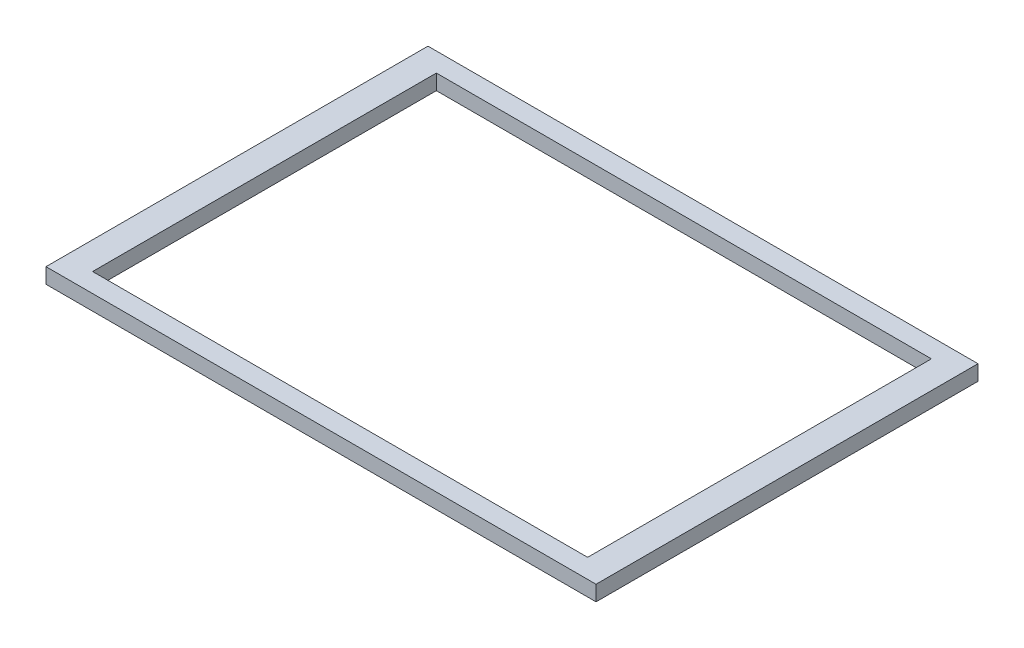
ISO-10303-21;
HEADER;
FILE_DESCRIPTION(('STEP AP214'),'2;1');
FILE_NAME('part.step','',(''),(''),'','','');
FILE_SCHEMA(('AUTOMOTIVE_DESIGN { 1 0 10303 214 1 1 1 1 }'));
ENDSEC;
DATA;
#1=APPLICATION_CONTEXT('core data for automotive mechanical design processes');
#2=APPLICATION_PROTOCOL_DEFINITION('international standard','automotive_design',2000,#1);
#3=PRODUCT_CONTEXT('',#1,'mechanical');
#4=PRODUCT('Part','Part','',(#3));
#5=PRODUCT_RELATED_PRODUCT_CATEGORY('part','',(#4));
#6=PRODUCT_DEFINITION_FORMATION('','',#4);
#7=PRODUCT_DEFINITION_CONTEXT('part definition',#1,'design');
#8=PRODUCT_DEFINITION('design','',#6,#7);
#9=PRODUCT_DEFINITION_SHAPE('','',#8);
#10=(LENGTH_UNIT() NAMED_UNIT(*) SI_UNIT(.MILLI.,.METRE.));
#11=(NAMED_UNIT(*) PLANE_ANGLE_UNIT() SI_UNIT($,.RADIAN.));
#12=(NAMED_UNIT(*) SI_UNIT($,.STERADIAN.) SOLID_ANGLE_UNIT());
#13=UNCERTAINTY_MEASURE_WITH_UNIT(LENGTH_MEASURE(1.E-05),#10,'distance_accuracy_value','');
#14=(GEOMETRIC_REPRESENTATION_CONTEXT(3) GLOBAL_UNCERTAINTY_ASSIGNED_CONTEXT((#13)) GLOBAL_UNIT_ASSIGNED_CONTEXT((#10,
#11,#12)) REPRESENTATION_CONTEXT('',''));
#15=CARTESIAN_POINT('',(0.,0.,0.));
#16=DIRECTION('',(0.,0.,1.));
#17=DIRECTION('',(1.,0.,0.));
#18=AXIS2_PLACEMENT_3D('',#15,#16,#17);
#19=CARTESIAN_POINT('',(0.,1.,0.));
#20=DIRECTION('',(0.,1.,0.));
#21=DIRECTION('',(0.,0.,1.));
#22=AXIS2_PLACEMENT_3D('',#19,#20,#21);
#23=PLANE('',#22);
#24=DIRECTION('',(0.,0.,1.));
#25=VECTOR('',#24,1.);
#26=CARTESIAN_POINT('',(-18.,1.,12.5));
#27=LINE('',#26,#25);
#28=CARTESIAN_POINT('',(-18.,1.,-12.5));
#29=VERTEX_POINT('',#28);
#30=CARTESIAN_POINT('',(-18.,1.,12.5));
#31=VERTEX_POINT('',#30);
#32=EDGE_CURVE('E141',#29,#31,#27,.T.);
#33=ORIENTED_EDGE('',*,*,#32,.T.);
#34=DIRECTION('',(1.,0.,0.));
#35=VECTOR('',#34,1.);
#36=CARTESIAN_POINT('',(18.,1.,12.5));
#37=LINE('',#36,#35);
#38=CARTESIAN_POINT('',(18.,1.,12.5));
#39=VERTEX_POINT('',#38);
#40=EDGE_CURVE('E144',#31,#39,#37,.T.);
#41=ORIENTED_EDGE('',*,*,#40,.T.);
#42=DIRECTION('',(0.,0.,-1.));
#43=VECTOR('',#42,1.);
#44=CARTESIAN_POINT('',(18.,1.,12.5));
#45=LINE('',#44,#43);
#46=CARTESIAN_POINT('',(18.,1.,-12.5));
#47=VERTEX_POINT('',#46);
#48=EDGE_CURVE('E147',#39,#47,#45,.T.);
#49=ORIENTED_EDGE('',*,*,#48,.T.);
#50=DIRECTION('',(-1.,0.,0.));
#51=VECTOR('',#50,1.);
#52=CARTESIAN_POINT('',(18.,1.,-12.5));
#53=LINE('',#52,#51);
#54=EDGE_CURVE('E149',#47,#29,#53,.T.);
#55=ORIENTED_EDGE('',*,*,#54,.T.);
#56=EDGE_LOOP('',(#33,#41,#49,#55));
#57=FACE_BOUND('',#56,.T.);
#58=DIRECTION('',(1.,0.,0.));
#59=VECTOR('',#58,1.);
#60=CARTESIAN_POINT('',(16.2,1.,11.25));
#61=LINE('',#60,#59);
#62=CARTESIAN_POINT('',(-16.2,1.,11.25));
#63=VERTEX_POINT('',#62);
#64=CARTESIAN_POINT('',(16.2,1.,11.25));
#65=VERTEX_POINT('',#64);
#66=EDGE_CURVE('E113',#63,#65,#61,.T.);
#67=ORIENTED_EDGE('',*,*,#66,.F.);
#68=DIRECTION('',(0.,0.,1.));
#69=VECTOR('',#68,1.);
#70=CARTESIAN_POINT('',(-16.2,1.,11.25));
#71=LINE('',#70,#69);
#72=CARTESIAN_POINT('',(-16.2,1.,-11.25));
#73=VERTEX_POINT('',#72);
#74=EDGE_CURVE('E105',#73,#63,#71,.T.);
#75=ORIENTED_EDGE('',*,*,#74,.F.);
#76=DIRECTION('',(-1.,0.,0.));
#77=VECTOR('',#76,1.);
#78=CARTESIAN_POINT('',(16.2,1.,-11.25));
#79=LINE('',#78,#77);
#80=CARTESIAN_POINT('',(16.2,1.,-11.25));
#81=VERTEX_POINT('',#80);
#82=EDGE_CURVE('E127',#81,#73,#79,.T.);
#83=ORIENTED_EDGE('',*,*,#82,.F.);
#84=DIRECTION('',(0.,0.,-1.));
#85=VECTOR('',#84,1.);
#86=CARTESIAN_POINT('',(16.2,1.,11.25));
#87=LINE('',#86,#85);
#88=EDGE_CURVE('E125',#65,#81,#87,.T.);
#89=ORIENTED_EDGE('',*,*,#88,.F.);
#90=EDGE_LOOP('',(#67,#75,#83,#89));
#91=FACE_BOUND('',#90,.T.);
#92=ADVANCED_FACE('F40',(#57,#91),#23,.T.);
#93=CARTESIAN_POINT('',(0.,0.,0.));
#94=DIRECTION('',(0.,1.,0.));
#95=DIRECTION('',(0.,0.,1.));
#96=AXIS2_PLACEMENT_3D('',#93,#94,#95);
#97=PLANE('',#96);
#98=DIRECTION('',(0.,0.,1.));
#99=VECTOR('',#98,1.);
#100=CARTESIAN_POINT('',(-18.,0.,12.5));
#101=LINE('',#100,#99);
#102=CARTESIAN_POINT('',(-18.,0.,-12.5));
#103=VERTEX_POINT('',#102);
#104=CARTESIAN_POINT('',(-18.,0.,12.5));
#105=VERTEX_POINT('',#104);
#106=EDGE_CURVE('E121',#103,#105,#101,.T.);
#107=ORIENTED_EDGE('',*,*,#106,.F.);
#108=DIRECTION('',(-1.,0.,0.));
#109=VECTOR('',#108,1.);
#110=CARTESIAN_POINT('',(18.,0.,-12.5));
#111=LINE('',#110,#109);
#112=CARTESIAN_POINT('',(18.,0.,-12.5));
#113=VERTEX_POINT('',#112);
#114=EDGE_CURVE('E145',#113,#103,#111,.T.);
#115=ORIENTED_EDGE('',*,*,#114,.F.);
#116=DIRECTION('',(0.,0.,-1.));
#117=VECTOR('',#116,1.);
#118=CARTESIAN_POINT('',(18.,0.,12.5));
#119=LINE('',#118,#117);
#120=CARTESIAN_POINT('',(18.,0.,12.5));
#121=VERTEX_POINT('',#120);
#122=EDGE_CURVE('E156',#121,#113,#119,.T.);
#123=ORIENTED_EDGE('',*,*,#122,.F.);
#124=DIRECTION('',(1.,0.,0.));
#125=VECTOR('',#124,1.);
#126=CARTESIAN_POINT('',(18.,0.,12.5));
#127=LINE('',#126,#125);
#128=EDGE_CURVE('E154',#105,#121,#127,.T.);
#129=ORIENTED_EDGE('',*,*,#128,.F.);
#130=EDGE_LOOP('',(#107,#115,#123,#129));
#131=FACE_BOUND('',#130,.T.);
#132=DIRECTION('',(0.,0.,1.));
#133=VECTOR('',#132,1.);
#134=CARTESIAN_POINT('',(-16.2,0.,11.25));
#135=LINE('',#134,#133);
#136=CARTESIAN_POINT('',(-16.2,0.,-11.25));
#137=VERTEX_POINT('',#136);
#138=CARTESIAN_POINT('',(-16.2,0.,11.25));
#139=VERTEX_POINT('',#138);
#140=EDGE_CURVE('E63',#137,#139,#135,.T.);
#141=ORIENTED_EDGE('',*,*,#140,.T.);
#142=DIRECTION('',(1.,0.,0.));
#143=VECTOR('',#142,1.);
#144=CARTESIAN_POINT('',(16.2,0.,11.25));
#145=LINE('',#144,#143);
#146=CARTESIAN_POINT('',(16.2,0.,11.25));
#147=VERTEX_POINT('',#146);
#148=EDGE_CURVE('E120',#139,#147,#145,.T.);
#149=ORIENTED_EDGE('',*,*,#148,.T.);
#150=DIRECTION('',(0.,0.,-1.));
#151=VECTOR('',#150,1.);
#152=CARTESIAN_POINT('',(16.2,0.,11.25));
#153=LINE('',#152,#151);
#154=CARTESIAN_POINT('',(16.2,0.,-11.25));
#155=VERTEX_POINT('',#154);
#156=EDGE_CURVE('E133',#147,#155,#153,.T.);
#157=ORIENTED_EDGE('',*,*,#156,.T.);
#158=DIRECTION('',(-1.,0.,0.));
#159=VECTOR('',#158,1.);
#160=CARTESIAN_POINT('',(16.2,0.,-11.25));
#161=LINE('',#160,#159);
#162=EDGE_CURVE('E114',#155,#137,#161,.T.);
#163=ORIENTED_EDGE('',*,*,#162,.T.);
#164=EDGE_LOOP('',(#141,#149,#157,#163));
#165=FACE_BOUND('',#164,.T.);
#166=ADVANCED_FACE('F174',(#131,#165),#97,.F.);
#167=CARTESIAN_POINT('',(-18.,1.,12.5));
#168=DIRECTION('',(1.,0.,0.));
#169=DIRECTION('',(0.,0.,-1.));
#170=AXIS2_PLACEMENT_3D('',#167,#168,#169);
#171=PLANE('',#170);
#172=ORIENTED_EDGE('',*,*,#106,.T.);
#173=DIRECTION('',(0.,-1.,0.));
#174=VECTOR('',#173,1.);
#175=CARTESIAN_POINT('',(-18.,1.,12.5));
#176=LINE('',#175,#174);
#177=EDGE_CURVE('E11',#31,#105,#176,.T.);
#178=ORIENTED_EDGE('',*,*,#177,.F.);
#179=ORIENTED_EDGE('',*,*,#32,.F.);
#180=DIRECTION('',(0.,-1.,0.));
#181=VECTOR('',#180,1.);
#182=CARTESIAN_POINT('',(-18.,1.,-12.5));
#183=LINE('',#182,#181);
#184=EDGE_CURVE('E151',#29,#103,#183,.T.);
#185=ORIENTED_EDGE('',*,*,#184,.T.);
#186=EDGE_LOOP('',(#172,#178,#179,#185));
#187=FACE_BOUND('',#186,.T.);
#188=ADVANCED_FACE('F42',(#187),#171,.F.);
#189=CARTESIAN_POINT('',(18.,1.,12.5));
#190=DIRECTION('',(0.,0.,-1.));
#191=DIRECTION('',(-1.,0.,0.));
#192=AXIS2_PLACEMENT_3D('',#189,#190,#191);
#193=PLANE('',#192);
#194=ORIENTED_EDGE('',*,*,#128,.T.);
#195=DIRECTION('',(0.,-1.,0.));
#196=VECTOR('',#195,1.);
#197=CARTESIAN_POINT('',(18.,1.,12.5));
#198=LINE('',#197,#196);
#199=EDGE_CURVE('E48',#39,#121,#198,.T.);
#200=ORIENTED_EDGE('',*,*,#199,.F.);
#201=ORIENTED_EDGE('',*,*,#40,.F.);
#202=ORIENTED_EDGE('',*,*,#177,.T.);
#203=EDGE_LOOP('',(#194,#200,#201,#202));
#204=FACE_BOUND('',#203,.T.);
#205=ADVANCED_FACE('F184',(#204),#193,.F.);
#206=CARTESIAN_POINT('',(18.,1.,12.5));
#207=DIRECTION('',(-1.,0.,0.));
#208=DIRECTION('',(0.,0.,1.));
#209=AXIS2_PLACEMENT_3D('',#206,#207,#208);
#210=PLANE('',#209);
#211=ORIENTED_EDGE('',*,*,#122,.T.);
#212=DIRECTION('',(0.,-1.,0.));
#213=VECTOR('',#212,1.);
#214=CARTESIAN_POINT('',(18.,1.,-12.5));
#215=LINE('',#214,#213);
#216=EDGE_CURVE('E161',#47,#113,#215,.T.);
#217=ORIENTED_EDGE('',*,*,#216,.F.);
#218=ORIENTED_EDGE('',*,*,#48,.F.);
#219=ORIENTED_EDGE('',*,*,#199,.T.);
#220=EDGE_LOOP('',(#211,#217,#218,#219));
#221=FACE_BOUND('',#220,.T.);
#222=ADVANCED_FACE('F168',(#221),#210,.F.);
#223=CARTESIAN_POINT('',(18.,1.,-12.5));
#224=DIRECTION('',(0.,0.,1.));
#225=DIRECTION('',(1.,0.,0.));
#226=AXIS2_PLACEMENT_3D('',#223,#224,#225);
#227=PLANE('',#226);
#228=ORIENTED_EDGE('',*,*,#114,.T.);
#229=ORIENTED_EDGE('',*,*,#184,.F.);
#230=ORIENTED_EDGE('',*,*,#54,.F.);
#231=ORIENTED_EDGE('',*,*,#216,.T.);
#232=EDGE_LOOP('',(#228,#229,#230,#231));
#233=FACE_BOUND('',#232,.T.);
#234=ADVANCED_FACE('F178',(#233),#227,.F.);
#235=CARTESIAN_POINT('',(-16.2,1.,11.25));
#236=DIRECTION('',(1.,0.,0.));
#237=DIRECTION('',(0.,0.,-1.));
#238=AXIS2_PLACEMENT_3D('',#235,#236,#237);
#239=PLANE('',#238);
#240=ORIENTED_EDGE('',*,*,#140,.F.);
#241=DIRECTION('',(0.,-1.,0.));
#242=VECTOR('',#241,1.);
#243=CARTESIAN_POINT('',(-16.2,1.,-11.25));
#244=LINE('',#243,#242);
#245=EDGE_CURVE('E109',#73,#137,#244,.T.);
#246=ORIENTED_EDGE('',*,*,#245,.F.);
#247=ORIENTED_EDGE('',*,*,#74,.T.);
#248=DIRECTION('',(0.,-1.,0.));
#249=VECTOR('',#248,1.);
#250=CARTESIAN_POINT('',(-16.2,1.,11.25));
#251=LINE('',#250,#249);
#252=EDGE_CURVE('E108',#63,#139,#251,.T.);
#253=ORIENTED_EDGE('',*,*,#252,.T.);
#254=EDGE_LOOP('',(#240,#246,#247,#253));
#255=FACE_BOUND('',#254,.T.);
#256=ADVANCED_FACE('F107',(#255),#239,.T.);
#257=CARTESIAN_POINT('',(16.2,1.,11.25));
#258=DIRECTION('',(0.,0.,-1.));
#259=DIRECTION('',(-1.,0.,0.));
#260=AXIS2_PLACEMENT_3D('',#257,#258,#259);
#261=PLANE('',#260);
#262=ORIENTED_EDGE('',*,*,#148,.F.);
#263=ORIENTED_EDGE('',*,*,#252,.F.);
#264=ORIENTED_EDGE('',*,*,#66,.T.);
#265=DIRECTION('',(0.,-1.,0.));
#266=VECTOR('',#265,1.);
#267=CARTESIAN_POINT('',(16.2,1.,11.25));
#268=LINE('',#267,#266);
#269=EDGE_CURVE('E122',#65,#147,#268,.T.);
#270=ORIENTED_EDGE('',*,*,#269,.T.);
#271=EDGE_LOOP('',(#262,#263,#264,#270));
#272=FACE_BOUND('',#271,.T.);
#273=ADVANCED_FACE('F117',(#272),#261,.T.);
#274=CARTESIAN_POINT('',(16.2,1.,11.25));
#275=DIRECTION('',(-1.,0.,0.));
#276=DIRECTION('',(0.,0.,1.));
#277=AXIS2_PLACEMENT_3D('',#274,#275,#276);
#278=PLANE('',#277);
#279=ORIENTED_EDGE('',*,*,#156,.F.);
#280=ORIENTED_EDGE('',*,*,#269,.F.);
#281=ORIENTED_EDGE('',*,*,#88,.T.);
#282=DIRECTION('',(0.,-1.,0.));
#283=VECTOR('',#282,1.);
#284=CARTESIAN_POINT('',(16.2,1.,-11.25));
#285=LINE('',#284,#283);
#286=EDGE_CURVE('E55',#81,#155,#285,.T.);
#287=ORIENTED_EDGE('',*,*,#286,.T.);
#288=EDGE_LOOP('',(#279,#280,#281,#287));
#289=FACE_BOUND('',#288,.T.);
#290=ADVANCED_FACE('F207',(#289),#278,.T.);
#291=CARTESIAN_POINT('',(16.2,1.,-11.25));
#292=DIRECTION('',(0.,0.,1.));
#293=DIRECTION('',(1.,0.,0.));
#294=AXIS2_PLACEMENT_3D('',#291,#292,#293);
#295=PLANE('',#294);
#296=ORIENTED_EDGE('',*,*,#162,.F.);
#297=ORIENTED_EDGE('',*,*,#286,.F.);
#298=ORIENTED_EDGE('',*,*,#82,.T.);
#299=ORIENTED_EDGE('',*,*,#245,.T.);
#300=EDGE_LOOP('',(#296,#297,#298,#299));
#301=FACE_BOUND('',#300,.T.);
#302=ADVANCED_FACE('F211',(#301),#295,.T.);
#303=CLOSED_SHELL('',(#92,#166,#188,#205,#222,#234,#256,#273,#290,#302));
#304=MANIFOLD_SOLID_BREP('B2',#303);
#305=ADVANCED_BREP_SHAPE_REPRESENTATION('',(#18,#304),#14);
#306=SHAPE_DEFINITION_REPRESENTATION(#9,#305);
ENDSEC;
END-ISO-10303-21;
